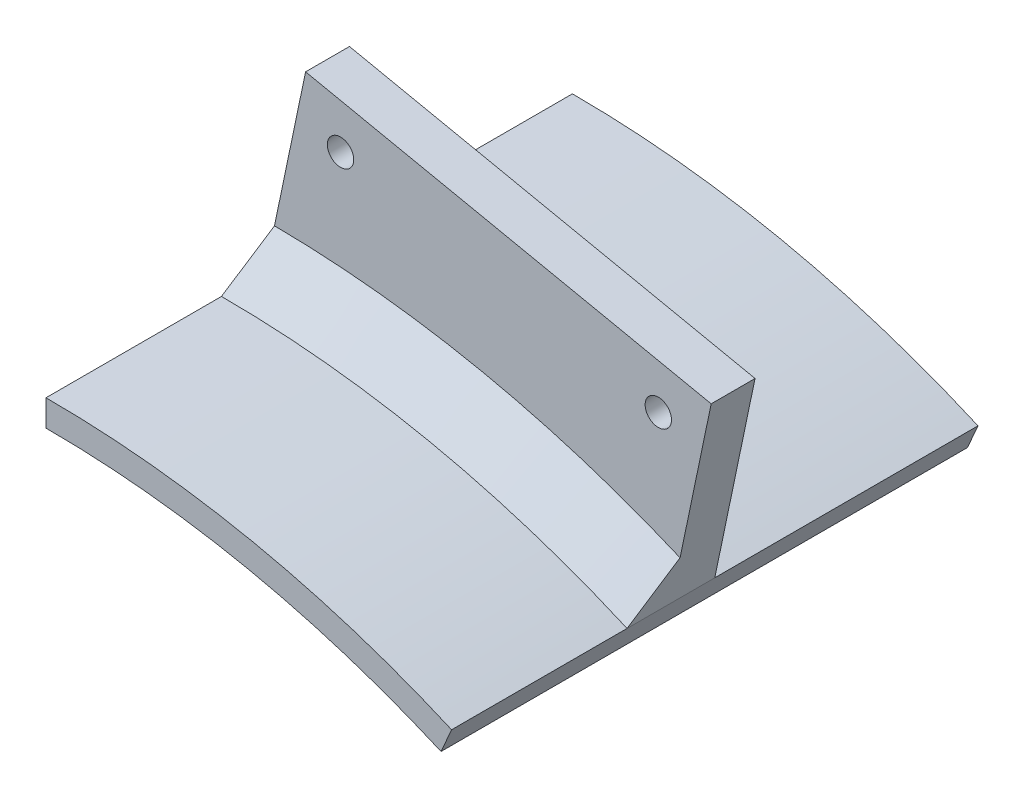
ISO-10303-21;
HEADER;
FILE_DESCRIPTION(('STEP AP214'),'2;1');
FILE_NAME('part.step','',(''),(''),'','','');
FILE_SCHEMA(('AUTOMOTIVE_DESIGN { 1 0 10303 214 1 1 1 1 }'));
ENDSEC;
DATA;
#1=APPLICATION_CONTEXT('core data for automotive mechanical design processes');
#2=APPLICATION_PROTOCOL_DEFINITION('international standard','automotive_design',2000,#1);
#3=PRODUCT_CONTEXT('',#1,'mechanical');
#4=PRODUCT('Part','Part','',(#3));
#5=PRODUCT_RELATED_PRODUCT_CATEGORY('part','',(#4));
#6=PRODUCT_DEFINITION_FORMATION('','',#4);
#7=PRODUCT_DEFINITION_CONTEXT('part definition',#1,'design');
#8=PRODUCT_DEFINITION('design','',#6,#7);
#9=PRODUCT_DEFINITION_SHAPE('','',#8);
#10=(LENGTH_UNIT() NAMED_UNIT(*) SI_UNIT(.MILLI.,.METRE.));
#11=(NAMED_UNIT(*) PLANE_ANGLE_UNIT() SI_UNIT($,.RADIAN.));
#12=(NAMED_UNIT(*) SI_UNIT($,.STERADIAN.) SOLID_ANGLE_UNIT());
#13=UNCERTAINTY_MEASURE_WITH_UNIT(LENGTH_MEASURE(1.E-05),#10,'distance_accuracy_value','');
#14=(GEOMETRIC_REPRESENTATION_CONTEXT(3) GLOBAL_UNCERTAINTY_ASSIGNED_CONTEXT((#13)) GLOBAL_UNIT_ASSIGNED_CONTEXT((#10,
#11,#12)) REPRESENTATION_CONTEXT('',''));
#15=CARTESIAN_POINT('',(0.,0.,0.));
#16=DIRECTION('',(0.,0.,1.));
#17=DIRECTION('',(1.,0.,0.));
#18=AXIS2_PLACEMENT_3D('',#15,#16,#17);
#19=CARTESIAN_POINT('',(0.,0.,60.));
#20=DIRECTION('',(0.,0.,-1.));
#21=DIRECTION('',(-1.,0.,0.));
#22=AXIS2_PLACEMENT_3D('',#19,#20,#21);
#23=CYLINDRICAL_SURFACE('',#22,115.5);
#24=DIRECTION('',(0.,0.,-1.));
#25=VECTOR('',#24,1.);
#26=CARTESIAN_POINT('',(46.2291529799494,105.84477037037,60.));
#27=LINE('',#26,#25);
#28=CARTESIAN_POINT('',(46.2291529799494,105.84477037037,60.));
#29=VERTEX_POINT('',#28);
#30=CARTESIAN_POINT('',(46.2291529799494,105.84477037037,40.));
#31=VERTEX_POINT('',#30);
#32=EDGE_CURVE('E170',#29,#31,#27,.T.);
#33=ORIENTED_EDGE('',*,*,#32,.T.);
#34=CARTESIAN_POINT('',(0.,0.,40.));
#35=DIRECTION('',(0.,0.,-1.));
#36=DIRECTION('',(-1.,0.,0.));
#37=AXIS2_PLACEMENT_3D('',#34,#35,#36);
#38=CIRCLE('',#37,115.5);
#39=CARTESIAN_POINT('',(0.,115.5,40.));
#40=VERTEX_POINT('',#39);
#41=EDGE_CURVE('E181',#31,#40,#38,.F.);
#42=ORIENTED_EDGE('',*,*,#41,.T.);
#43=DIRECTION('',(0.,0.,-1.));
#44=VECTOR('',#43,1.);
#45=CARTESIAN_POINT('',(0.,115.5,60.));
#46=LINE('',#45,#44);
#47=CARTESIAN_POINT('',(0.,115.5,60.));
#48=VERTEX_POINT('',#47);
#49=EDGE_CURVE('E178',#48,#40,#46,.T.);
#50=ORIENTED_EDGE('',*,*,#49,.F.);
#51=CARTESIAN_POINT('',(0.,0.,60.));
#52=DIRECTION('',(0.,0.,1.));
#53=DIRECTION('',(1.,0.,0.));
#54=AXIS2_PLACEMENT_3D('',#51,#52,#53);
#55=CIRCLE('',#54,115.5);
#56=EDGE_CURVE('E152',#29,#48,#55,.T.);
#57=ORIENTED_EDGE('',*,*,#56,.F.);
#58=EDGE_LOOP('',(#33,#42,#50,#57));
#59=FACE_BOUND('',#58,.T.);
#60=ADVANCED_FACE('F33',(#59),#23,.T.);
#61=CARTESIAN_POINT('',(0.,115.5,30.));
#62=VERTEX_POINT('',#61);
#63=CARTESIAN_POINT('',(0.,115.5,0.));
#64=VERTEX_POINT('',#63);
#65=EDGE_CURVE('E77',#62,#64,#46,.T.);
#66=ORIENTED_EDGE('',*,*,#65,.F.);
#67=CARTESIAN_POINT('',(0.,0.,30.));
#68=DIRECTION('',(0.,0.,1.));
#69=DIRECTION('',(-1.,0.,0.));
#70=AXIS2_PLACEMENT_3D('',#67,#68,#69);
#71=CIRCLE('',#70,115.5);
#72=CARTESIAN_POINT('',(46.2291529799494,105.84477037037,30.));
#73=VERTEX_POINT('',#72);
#74=EDGE_CURVE('E123',#73,#62,#71,.T.);
#75=ORIENTED_EDGE('',*,*,#74,.F.);
#76=CARTESIAN_POINT('',(46.2291529799494,105.84477037037,0.));
#77=VERTEX_POINT('',#76);
#78=EDGE_CURVE('E162',#73,#77,#27,.T.);
#79=ORIENTED_EDGE('',*,*,#78,.T.);
#80=CARTESIAN_POINT('',(0.,0.,0.));
#81=DIRECTION('',(0.,0.,1.));
#82=DIRECTION('',(1.,0.,0.));
#83=AXIS2_PLACEMENT_3D('',#80,#81,#82);
#84=CIRCLE('',#83,115.5);
#85=EDGE_CURVE('E151',#77,#64,#84,.T.);
#86=ORIENTED_EDGE('',*,*,#85,.T.);
#87=EDGE_LOOP('',(#66,#75,#79,#86));
#88=FACE_BOUND('',#87,.T.);
#89=ADVANCED_FACE('F211',(#88),#23,.T.);
#90=CARTESIAN_POINT('',(0.,112.5,60.));
#91=DIRECTION('',(1.,0.,0.));
#92=DIRECTION('',(0.,0.,-1.));
#93=AXIS2_PLACEMENT_3D('',#90,#91,#92);
#94=PLANE('',#93);
#95=DIRECTION('',(0.,-1.,0.));
#96=VECTOR('',#95,1.);
#97=CARTESIAN_POINT('',(0.,112.5,0.));
#98=LINE('',#97,#96);
#99=CARTESIAN_POINT('',(0.,112.5,0.));
#100=VERTEX_POINT('',#99);
#101=EDGE_CURVE('E164',#64,#100,#98,.T.);
#102=ORIENTED_EDGE('',*,*,#101,.T.);
#103=DIRECTION('',(0.,0.,-1.));
#104=VECTOR('',#103,1.);
#105=CARTESIAN_POINT('',(0.,112.5,60.));
#106=LINE('',#105,#104);
#107=CARTESIAN_POINT('',(0.,112.5,60.));
#108=VERTEX_POINT('',#107);
#109=EDGE_CURVE('E175',#108,#100,#106,.T.);
#110=ORIENTED_EDGE('',*,*,#109,.F.);
#111=DIRECTION('',(0.,-1.,0.));
#112=VECTOR('',#111,1.);
#113=CARTESIAN_POINT('',(0.,112.5,60.));
#114=LINE('',#113,#112);
#115=EDGE_CURVE('E155',#48,#108,#114,.T.);
#116=ORIENTED_EDGE('',*,*,#115,.F.);
#117=ORIENTED_EDGE('',*,*,#49,.T.);
#118=DIRECTION('',(0.,0.,1.));
#119=VECTOR('',#118,1.);
#120=CARTESIAN_POINT('',(0.,115.5,30.));
#121=LINE('',#120,#119);
#122=EDGE_CURVE('E70',#62,#40,#121,.T.);
#123=ORIENTED_EDGE('',*,*,#122,.F.);
#124=ORIENTED_EDGE('',*,*,#65,.T.);
#125=EDGE_LOOP('',(#102,#110,#116,#117,#123,#124));
#126=FACE_BOUND('',#125,.T.);
#127=ADVANCED_FACE('F208',(#126),#94,.F.);
#128=CARTESIAN_POINT('',(0.,0.,60.));
#129=DIRECTION('',(0.,0.,-1.));
#130=DIRECTION('',(-1.,0.,0.));
#131=AXIS2_PLACEMENT_3D('',#128,#129,#130);
#132=CYLINDRICAL_SURFACE('',#131,112.5);
#133=CARTESIAN_POINT('',(0.,0.,0.));
#134=DIRECTION('',(0.,0.,-1.));
#135=DIRECTION('',(1.,0.,0.));
#136=AXIS2_PLACEMENT_3D('',#133,#134,#135);
#137=CIRCLE('',#136,112.5);
#138=CARTESIAN_POINT('',(45.028395759691,103.095555555556,0.));
#139=VERTEX_POINT('',#138);
#140=EDGE_CURVE('E166',#100,#139,#137,.T.);
#141=ORIENTED_EDGE('',*,*,#140,.T.);
#142=DIRECTION('',(0.,0.,-1.));
#143=VECTOR('',#142,1.);
#144=CARTESIAN_POINT('',(45.028395759691,103.095555555556,60.));
#145=LINE('',#144,#143);
#146=CARTESIAN_POINT('',(45.028395759691,103.095555555556,60.));
#147=VERTEX_POINT('',#146);
#148=EDGE_CURVE('E172',#147,#139,#145,.T.);
#149=ORIENTED_EDGE('',*,*,#148,.F.);
#150=CARTESIAN_POINT('',(0.,0.,60.));
#151=DIRECTION('',(0.,0.,-1.));
#152=DIRECTION('',(1.,0.,0.));
#153=AXIS2_PLACEMENT_3D('',#150,#151,#152);
#154=CIRCLE('',#153,112.5);
#155=EDGE_CURVE('E158',#108,#147,#154,.T.);
#156=ORIENTED_EDGE('',*,*,#155,.F.);
#157=ORIENTED_EDGE('',*,*,#109,.T.);
#158=EDGE_LOOP('',(#141,#149,#156,#157));
#159=FACE_BOUND('',#158,.T.);
#160=ADVANCED_FACE('F205',(#159),#132,.F.);
#161=CARTESIAN_POINT('',(45.028395759691,103.095555555556,60.));
#162=DIRECTION('',(-0.916404938271605,0.400252406752809,0.));
#163=DIRECTION('',(-0.400252406752809,-0.916404938271605,0.));
#164=AXIS2_PLACEMENT_3D('',#161,#162,#163);
#165=PLANE('',#164);
#166=DIRECTION('',(0.400252406752809,0.916404938271605,0.));
#167=VECTOR('',#166,1.);
#168=CARTESIAN_POINT('',(45.028395759691,103.095555555556,0.));
#169=LINE('',#168,#167);
#170=EDGE_CURVE('E156',#139,#77,#169,.T.);
#171=ORIENTED_EDGE('',*,*,#170,.T.);
#172=ORIENTED_EDGE('',*,*,#78,.F.);
#173=DIRECTION('',(0.,0.,1.));
#174=VECTOR('',#173,1.);
#175=CARTESIAN_POINT('',(46.2291529799494,105.84477037037,30.));
#176=LINE('',#175,#174);
#177=EDGE_CURVE('E53',#73,#31,#176,.T.);
#178=ORIENTED_EDGE('',*,*,#177,.T.);
#179=ORIENTED_EDGE('',*,*,#32,.F.);
#180=DIRECTION('',(0.400252406752809,0.916404938271605,0.));
#181=VECTOR('',#180,1.);
#182=CARTESIAN_POINT('',(45.028395759691,103.095555555556,60.));
#183=LINE('',#182,#181);
#184=EDGE_CURVE('E160',#147,#29,#183,.T.);
#185=ORIENTED_EDGE('',*,*,#184,.F.);
#186=ORIENTED_EDGE('',*,*,#148,.T.);
#187=EDGE_LOOP('',(#171,#172,#178,#179,#185,#186));
#188=FACE_BOUND('',#187,.T.);
#189=ADVANCED_FACE('F198',(#188),#165,.F.);
#190=CARTESIAN_POINT('',(0.,0.,60.));
#191=DIRECTION('',(0.,0.,1.));
#192=DIRECTION('',(1.,0.,0.));
#193=AXIS2_PLACEMENT_3D('',#190,#191,#192);
#194=PLANE('',#193);
#195=ORIENTED_EDGE('',*,*,#56,.T.);
#196=ORIENTED_EDGE('',*,*,#115,.T.);
#197=ORIENTED_EDGE('',*,*,#155,.T.);
#198=ORIENTED_EDGE('',*,*,#184,.T.);
#199=EDGE_LOOP('',(#195,#196,#197,#198));
#200=FACE_BOUND('',#199,.T.);
#201=ADVANCED_FACE('F194',(#200),#194,.T.);
#202=CARTESIAN_POINT('',(0.,0.,0.));
#203=DIRECTION('',(0.,0.,1.));
#204=DIRECTION('',(1.,0.,0.));
#205=AXIS2_PLACEMENT_3D('',#202,#203,#204);
#206=PLANE('',#205);
#207=ORIENTED_EDGE('',*,*,#85,.F.);
#208=ORIENTED_EDGE('',*,*,#170,.F.);
#209=ORIENTED_EDGE('',*,*,#140,.F.);
#210=ORIENTED_EDGE('',*,*,#101,.F.);
#211=EDGE_LOOP('',(#207,#208,#209,#210));
#212=FACE_BOUND('',#211,.T.);
#213=ADVANCED_FACE('F197',(#212),#206,.F.);
#214=CARTESIAN_POINT('',(0.,0.,30.));
#215=DIRECTION('',(0.,0.,-1.));
#216=DIRECTION('',(-1.,0.,0.));
#217=AXIS2_PLACEMENT_3D('',#214,#215,#216);
#218=PLANE('',#217);
#219=CARTESIAN_POINT('',(8.5707538792547,131.525823236128,30.));
#220=DIRECTION('',(0.,0.,-1.));
#221=DIRECTION('',(-1.,0.,0.));
#222=AXIS2_PLACEMENT_3D('',#219,#220,#221);
#223=CIRCLE('',#222,1.5);
#224=CARTESIAN_POINT('',(7.0707538792547,131.525823236128,30.));
#225=VERTEX_POINT('',#224);
#226=EDGE_CURVE('E143',#225,#225,#223,.T.);
#227=ORIENTED_EDGE('',*,*,#226,.F.);
#228=EDGE_LOOP('',(#227));
#229=FACE_BOUND('',#228,.T.);
#230=ORIENTED_EDGE('',*,*,#74,.T.);
#231=DIRECTION('',(0.204444444444444,0.978878168688935,0.));
#232=VECTOR('',#231,1.);
#233=CARTESIAN_POINT('',(4.58764573224751,137.465606672166,30.));
#234=LINE('',#233,#232);
#235=CARTESIAN_POINT('',(4.58764573224751,137.465606672166,30.));
#236=VERTEX_POINT('',#235);
#237=EDGE_CURVE('E115',#62,#236,#234,.T.);
#238=ORIENTED_EDGE('',*,*,#237,.T.);
#239=DIRECTION('',(0.978878168688935,-0.204444444444445,0.));
#240=VECTOR('',#239,1.);
#241=CARTESIAN_POINT('',(27.7022222222222,132.637991857351,30.));
#242=LINE('',#241,#240);
#243=CARTESIAN_POINT('',(50.8167987121969,127.810377042536,30.));
#244=VERTEX_POINT('',#243);
#245=EDGE_CURVE('E121',#236,#244,#242,.T.);
#246=ORIENTED_EDGE('',*,*,#245,.T.);
#247=DIRECTION('',(-0.204444444444445,-0.978878168688935,0.));
#248=VECTOR('',#247,1.);
#249=CARTESIAN_POINT('',(50.8167987121969,127.810377042536,30.));
#250=LINE('',#249,#248);
#251=EDGE_CURVE('E136',#244,#73,#250,.T.);
#252=ORIENTED_EDGE('',*,*,#251,.T.);
#253=EDGE_LOOP('',(#230,#238,#246,#252));
#254=FACE_BOUND('',#253,.T.);
#255=CARTESIAN_POINT('',(44.7892461207453,123.961378791684,30.));
#256=DIRECTION('',(0.,0.,-1.));
#257=DIRECTION('',(1.,0.,0.));
#258=AXIS2_PLACEMENT_3D('',#255,#256,#257);
#259=CIRCLE('',#258,1.5);
#260=CARTESIAN_POINT('',(46.2892461207453,123.961378791684,30.));
#261=VERTEX_POINT('',#260);
#262=EDGE_CURVE('E242',#261,#261,#259,.T.);
#263=ORIENTED_EDGE('',*,*,#262,.F.);
#264=EDGE_LOOP('',(#263));
#265=FACE_BOUND('',#264,.T.);
#266=ADVANCED_FACE('F117',(#229,#254,#265),#218,.T.);
#267=CARTESIAN_POINT('',(0.,0.,35.));
#268=DIRECTION('',(0.,0.,-1.));
#269=DIRECTION('',(-1.,0.,0.));
#270=AXIS2_PLACEMENT_3D('',#267,#268,#269);
#271=PLANE('',#270);
#272=DIRECTION('',(0.204444444444444,0.978878168688935,0.));
#273=VECTOR('',#272,1.);
#274=CARTESIAN_POINT('',(4.58764573224751,137.465606672166,35.));
#275=LINE('',#274,#273);
#276=CARTESIAN_POINT('',(1.04333593495647,120.49548311089,35.));
#277=VERTEX_POINT('',#276);
#278=CARTESIAN_POINT('',(4.58764573224751,137.465606672166,35.));
#279=VERTEX_POINT('',#278);
#280=EDGE_CURVE('E128',#277,#279,#275,.T.);
#281=ORIENTED_EDGE('',*,*,#280,.F.);
#282=CARTESIAN_POINT('',(0.,0.,35.));
#283=DIRECTION('',(0.,0.,-1.));
#284=DIRECTION('',(-1.,0.,0.));
#285=AXIS2_PLACEMENT_3D('',#282,#283,#284);
#286=CIRCLE('',#285,120.5);
#287=CARTESIAN_POINT('',(47.2724889149059,110.840253481261,35.));
#288=VERTEX_POINT('',#287);
#289=EDGE_CURVE('E184',#277,#288,#286,.T.);
#290=ORIENTED_EDGE('',*,*,#289,.T.);
#291=DIRECTION('',(-0.204444444444445,-0.978878168688935,0.));
#292=VECTOR('',#291,1.);
#293=CARTESIAN_POINT('',(50.8167987121969,127.810377042536,35.));
#294=LINE('',#293,#292);
#295=CARTESIAN_POINT('',(50.8167987121969,127.810377042536,35.));
#296=VERTEX_POINT('',#295);
#297=EDGE_CURVE('E145',#296,#288,#294,.T.);
#298=ORIENTED_EDGE('',*,*,#297,.F.);
#299=DIRECTION('',(0.978878168688935,-0.204444444444443,0.));
#300=VECTOR('',#299,1.);
#301=CARTESIAN_POINT('',(27.7022222222222,132.637991857351,35.));
#302=LINE('',#301,#300);
#303=EDGE_CURVE('E142',#279,#296,#302,.T.);
#304=ORIENTED_EDGE('',*,*,#303,.F.);
#305=EDGE_LOOP('',(#281,#290,#298,#304));
#306=FACE_BOUND('',#305,.T.);
#307=CARTESIAN_POINT('',(8.5707538792547,131.525823236128,35.));
#308=DIRECTION('',(0.,0.,-1.));
#309=DIRECTION('',(-1.,0.,0.));
#310=AXIS2_PLACEMENT_3D('',#307,#308,#309);
#311=CIRCLE('',#310,1.5);
#312=CARTESIAN_POINT('',(7.0707538792547,131.525823236128,35.));
#313=VERTEX_POINT('',#312);
#314=EDGE_CURVE('E237',#313,#313,#311,.T.);
#315=ORIENTED_EDGE('',*,*,#314,.T.);
#316=EDGE_LOOP('',(#315));
#317=FACE_BOUND('',#316,.T.);
#318=CARTESIAN_POINT('',(44.7892461207453,123.961378791684,35.));
#319=DIRECTION('',(0.,0.,-1.));
#320=DIRECTION('',(1.,0.,0.));
#321=AXIS2_PLACEMENT_3D('',#318,#319,#320);
#322=CIRCLE('',#321,1.5);
#323=CARTESIAN_POINT('',(46.2892461207453,123.961378791684,35.));
#324=VERTEX_POINT('',#323);
#325=EDGE_CURVE('E240',#324,#324,#322,.T.);
#326=ORIENTED_EDGE('',*,*,#325,.T.);
#327=EDGE_LOOP('',(#326));
#328=FACE_BOUND('',#327,.T.);
#329=ADVANCED_FACE('F193',(#306,#317,#328),#271,.F.);
#330=CARTESIAN_POINT('',(4.58764573224751,137.465606672166,30.));
#331=DIRECTION('',(0.978878168688935,-0.204444444444444,0.));
#332=DIRECTION('',(0.204444444444444,0.978878168688935,0.));
#333=AXIS2_PLACEMENT_3D('',#330,#331,#332);
#334=PLANE('',#333);
#335=ORIENTED_EDGE('',*,*,#122,.T.);
#336=CARTESIAN_POINT('',(0.,115.5,40.));
#337=CARTESIAN_POINT('',(0.173964630958235,116.33294109474,39.1670426298331));
#338=CARTESIAN_POINT('',(0.347891607773665,117.165701901781,38.3338972776516));
#339=CARTESIAN_POINT('',(0.695670252759001,118.830862938744,36.6672306109841));
#340=CARTESIAN_POINT('',(0.869521920929061,119.663263168666,35.833709296499));
#341=CARTESIAN_POINT('',(1.04333593495647,120.49548311089,35.));
#342=B_SPLINE_CURVE_WITH_KNOTS('',3,(#336,#337,#338,#339,#340,#341),.UNSPECIFIED.,.F.,.F.,(4,2,
4),(0.,3.57223333446058,7.14446666152731),.UNSPECIFIED.);
#343=EDGE_CURVE('E46',#40,#277,#342,.T.);
#344=ORIENTED_EDGE('',*,*,#343,.T.);
#345=ORIENTED_EDGE('',*,*,#280,.T.);
#346=DIRECTION('',(0.,0.,1.));
#347=VECTOR('',#346,1.);
#348=CARTESIAN_POINT('',(4.58764573224751,137.465606672166,30.));
#349=LINE('',#348,#347);
#350=EDGE_CURVE('E126',#236,#279,#349,.T.);
#351=ORIENTED_EDGE('',*,*,#350,.F.);
#352=ORIENTED_EDGE('',*,*,#237,.F.);
#353=EDGE_LOOP('',(#335,#344,#345,#351,#352));
#354=FACE_BOUND('',#353,.T.);
#355=ADVANCED_FACE('F127',(#354),#334,.F.);
#356=CARTESIAN_POINT('',(27.7022222222222,132.637991857351,30.));
#357=DIRECTION('',(-0.204444444444443,-0.978878168688935,0.));
#358=DIRECTION('',(0.978878168688935,-0.204444444444443,0.));
#359=AXIS2_PLACEMENT_3D('',#356,#357,#358);
#360=PLANE('',#359);
#361=ORIENTED_EDGE('',*,*,#303,.T.);
#362=DIRECTION('',(0.,0.,1.));
#363=VECTOR('',#362,1.);
#364=CARTESIAN_POINT('',(50.8167987121969,127.810377042536,30.));
#365=LINE('',#364,#363);
#366=EDGE_CURVE('E131',#244,#296,#365,.T.);
#367=ORIENTED_EDGE('',*,*,#366,.F.);
#368=ORIENTED_EDGE('',*,*,#245,.F.);
#369=ORIENTED_EDGE('',*,*,#350,.T.);
#370=EDGE_LOOP('',(#361,#367,#368,#369));
#371=FACE_BOUND('',#370,.T.);
#372=ADVANCED_FACE('F133',(#371),#360,.F.);
#373=CARTESIAN_POINT('',(50.8167987121969,127.810377042536,30.));
#374=DIRECTION('',(-0.978878168688935,0.204444444444445,0.));
#375=DIRECTION('',(-0.204444444444445,-0.978878168688935,0.));
#376=AXIS2_PLACEMENT_3D('',#373,#374,#375);
#377=PLANE('',#376);
#378=ORIENTED_EDGE('',*,*,#297,.T.);
#379=CARTESIAN_POINT('',(47.2724889149059,110.840253481261,35.));
#380=CARTESIAN_POINT('',(47.0986749008785,110.008033539036,35.833709296499));
#381=CARTESIAN_POINT('',(46.9248232327084,109.175633309114,36.6672306109841));
#382=CARTESIAN_POINT('',(46.5770445877231,107.510472272152,38.3338972776516));
#383=CARTESIAN_POINT('',(46.4031176109077,106.67771146511,39.1670426298331));
#384=CARTESIAN_POINT('',(46.2291529799494,105.84477037037,40.));
#385=B_SPLINE_CURVE_WITH_KNOTS('',3,(#379,#380,#381,#382,#383,#384),.UNSPECIFIED.,.F.,.F.,(4,2,
4),(0.,3.57223332706674,7.14446666152729),.UNSPECIFIED.);
#386=EDGE_CURVE('E11',#288,#31,#385,.T.);
#387=ORIENTED_EDGE('',*,*,#386,.T.);
#388=ORIENTED_EDGE('',*,*,#177,.F.);
#389=ORIENTED_EDGE('',*,*,#251,.F.);
#390=ORIENTED_EDGE('',*,*,#366,.T.);
#391=EDGE_LOOP('',(#378,#387,#388,#389,#390));
#392=FACE_BOUND('',#391,.T.);
#393=ADVANCED_FACE('F226',(#392),#377,.F.);
#394=CARTESIAN_POINT('',(8.5707538792547,131.525823236128,30.));
#395=DIRECTION('',(0.,0.,1.));
#396=DIRECTION('',(1.,0.,0.));
#397=AXIS2_PLACEMENT_3D('',#394,#395,#396);
#398=CYLINDRICAL_SURFACE('',#397,1.5);
#399=ORIENTED_EDGE('',*,*,#226,.T.);
#400=EDGE_LOOP('',(#399));
#401=FACE_BOUND('',#400,.T.);
#402=ORIENTED_EDGE('',*,*,#314,.F.);
#403=EDGE_LOOP('',(#402));
#404=FACE_BOUND('',#403,.T.);
#405=ADVANCED_FACE('F251',(#401,#404),#398,.F.);
#406=CARTESIAN_POINT('',(44.7892461207453,123.961378791684,30.));
#407=DIRECTION('',(0.,0.,1.));
#408=DIRECTION('',(1.,0.,0.));
#409=AXIS2_PLACEMENT_3D('',#406,#407,#408);
#410=CYLINDRICAL_SURFACE('',#409,1.5);
#411=ORIENTED_EDGE('',*,*,#262,.T.);
#412=EDGE_LOOP('',(#411));
#413=FACE_BOUND('',#412,.T.);
#414=ORIENTED_EDGE('',*,*,#325,.F.);
#415=EDGE_LOOP('',(#414));
#416=FACE_BOUND('',#415,.T.);
#417=ADVANCED_FACE('F266',(#413,#416),#410,.F.);
#418=CARTESIAN_POINT('',(0.,0.,40.));
#419=DIRECTION('',(0.,0.,-1.));
#420=DIRECTION('',(-1.,0.,0.));
#421=AXIS2_PLACEMENT_3D('',#418,#419,#420);
#422=CONICAL_SURFACE('',#421,115.5,0.785398163397444);
#423=ORIENTED_EDGE('',*,*,#386,.F.);
#424=ORIENTED_EDGE('',*,*,#289,.F.);
#425=ORIENTED_EDGE('',*,*,#343,.F.);
#426=ORIENTED_EDGE('',*,*,#41,.F.);
#427=EDGE_LOOP('',(#423,#424,#425,#426));
#428=FACE_BOUND('',#427,.T.);
#429=ADVANCED_FACE('F35',(#428),#422,.T.);
#430=CLOSED_SHELL('',(#60,#89,#127,#160,#189,#201,#213,#266,#329,#355,#372,#393,#405,#417,#429));
#431=MANIFOLD_SOLID_BREP('B2',#430);
#432=ADVANCED_BREP_SHAPE_REPRESENTATION('',(#18,#431),#14);
#433=SHAPE_DEFINITION_REPRESENTATION(#9,#432);
ENDSEC;
END-ISO-10303-21;
